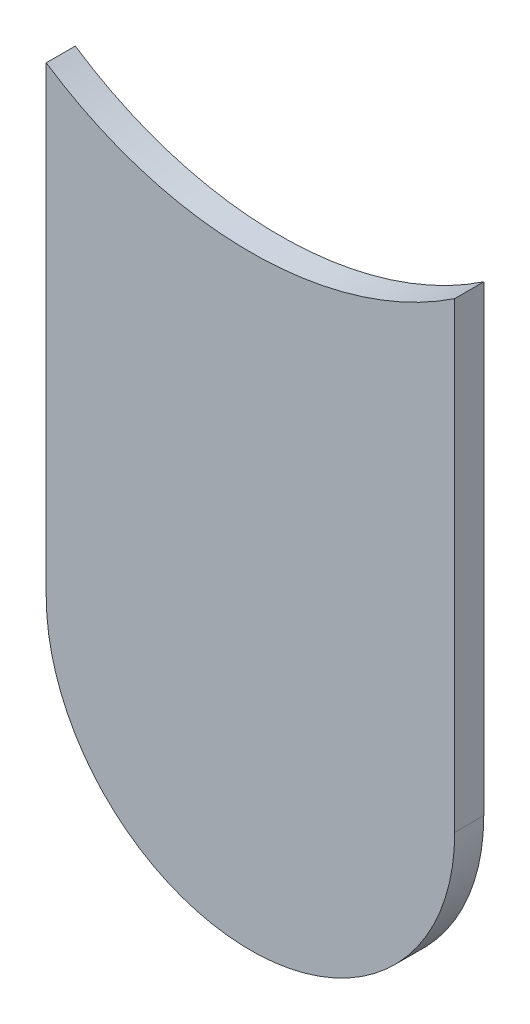
ISO-10303-21;
HEADER;
FILE_DESCRIPTION(('STEP AP214'),'2;1');
FILE_NAME('part.step','',(''),(''),'','','');
FILE_SCHEMA(('AUTOMOTIVE_DESIGN { 1 0 10303 214 1 1 1 1 }'));
ENDSEC;
DATA;
#1=APPLICATION_CONTEXT('core data for automotive mechanical design processes');
#2=APPLICATION_PROTOCOL_DEFINITION('international standard','automotive_design',2000,#1);
#3=PRODUCT_CONTEXT('',#1,'mechanical');
#4=PRODUCT('Part','Part','',(#3));
#5=PRODUCT_RELATED_PRODUCT_CATEGORY('part','',(#4));
#6=PRODUCT_DEFINITION_FORMATION('','',#4);
#7=PRODUCT_DEFINITION_CONTEXT('part definition',#1,'design');
#8=PRODUCT_DEFINITION('design','',#6,#7);
#9=PRODUCT_DEFINITION_SHAPE('','',#8);
#10=(LENGTH_UNIT() NAMED_UNIT(*) SI_UNIT(.MILLI.,.METRE.));
#11=(NAMED_UNIT(*) PLANE_ANGLE_UNIT() SI_UNIT($,.RADIAN.));
#12=(NAMED_UNIT(*) SI_UNIT($,.STERADIAN.) SOLID_ANGLE_UNIT());
#13=UNCERTAINTY_MEASURE_WITH_UNIT(LENGTH_MEASURE(1.E-05),#10,'distance_accuracy_value','');
#14=(GEOMETRIC_REPRESENTATION_CONTEXT(3) GLOBAL_UNCERTAINTY_ASSIGNED_CONTEXT((#13)) GLOBAL_UNIT_ASSIGNED_CONTEXT((#10,
#11,#12)) REPRESENTATION_CONTEXT('',''));
#15=CARTESIAN_POINT('',(0.,0.,0.));
#16=DIRECTION('',(0.,0.,1.));
#17=DIRECTION('',(1.,0.,0.));
#18=AXIS2_PLACEMENT_3D('',#15,#16,#17);
#19=CARTESIAN_POINT('',(117.1900247,115.5599924,0.));
#20=DIRECTION('',(-1.,0.,0.));
#21=DIRECTION('',(0.,1.,0.));
#22=AXIS2_PLACEMENT_3D('',#19,#20,#21);
#23=PLANE('',#22);
#24=DIRECTION('',(0.,1.,0.));
#25=VECTOR('',#24,1.);
#26=CARTESIAN_POINT('',(117.1900247,115.5599924,0.03556));
#27=LINE('',#26,#25);
#28=CARTESIAN_POINT('',(117.1900247,115.5599924,0.03556));
#29=VERTEX_POINT('',#28);
#30=CARTESIAN_POINT('',(117.1900247,116.125830609654,0.03556));
#31=VERTEX_POINT('',#30);
#32=EDGE_CURVE('E11',#29,#31,#27,.T.);
#33=ORIENTED_EDGE('',*,*,#32,.F.);
#34=DIRECTION('',(0.,0.,1.));
#35=VECTOR('',#34,1.);
#36=CARTESIAN_POINT('',(117.1900247,115.5599924,0.));
#37=LINE('',#36,#35);
#38=CARTESIAN_POINT('',(117.1900247,115.5599924,0.));
#39=VERTEX_POINT('',#38);
#40=EDGE_CURVE('E24',#39,#29,#37,.T.);
#41=ORIENTED_EDGE('',*,*,#40,.F.);
#42=DIRECTION('',(0.,1.,0.));
#43=VECTOR('',#42,1.);
#44=CARTESIAN_POINT('',(117.1900247,115.5599924,0.));
#45=LINE('',#44,#43);
#46=CARTESIAN_POINT('',(117.1900247,116.125830609654,0.));
#47=VERTEX_POINT('',#46);
#48=EDGE_CURVE('E75',#39,#47,#45,.T.);
#49=ORIENTED_EDGE('',*,*,#48,.T.);
#50=DIRECTION('',(0.,0.,1.));
#51=VECTOR('',#50,1.);
#52=CARTESIAN_POINT('',(117.1900247,116.125830609654,0.));
#53=LINE('',#52,#51);
#54=EDGE_CURVE('E37',#47,#31,#53,.T.);
#55=ORIENTED_EDGE('',*,*,#54,.T.);
#56=EDGE_LOOP('',(#33,#41,#49,#55));
#57=FACE_BOUND('',#56,.T.);
#58=ADVANCED_FACE('F17',(#57),#23,.F.);
#59=CARTESIAN_POINT('',(116.9400252,116.4999956,0.));
#60=DIRECTION('',(0.,0.,-1.));
#61=DIRECTION('',(1.,0.,0.));
#62=AXIS2_PLACEMENT_3D('',#59,#60,#61);
#63=CYLINDRICAL_SURFACE('',#62,0.4499991);
#64=DIRECTION('',(0.,0.,1.));
#65=VECTOR('',#64,1.);
#66=CARTESIAN_POINT('',(116.6900257,116.125830609654,0.));
#67=LINE('',#66,#65);
#68=CARTESIAN_POINT('',(116.6900257,116.125830609654,0.));
#69=VERTEX_POINT('',#68);
#70=CARTESIAN_POINT('',(116.6900257,116.125830609654,0.03556));
#71=VERTEX_POINT('',#70);
#72=EDGE_CURVE('E67',#69,#71,#67,.T.);
#73=ORIENTED_EDGE('',*,*,#72,.T.);
#74=CARTESIAN_POINT('',(116.9400252,116.4999956,0.03556));
#75=DIRECTION('',(0.,0.,1.));
#76=DIRECTION('',(1.,0.,0.));
#77=AXIS2_PLACEMENT_3D('',#74,#75,#76);
#78=CIRCLE('',#77,0.4499991);
#79=EDGE_CURVE('E82',#71,#31,#78,.T.);
#80=ORIENTED_EDGE('',*,*,#79,.T.);
#81=ORIENTED_EDGE('',*,*,#54,.F.);
#82=CARTESIAN_POINT('',(116.9400252,116.4999956,0.));
#83=DIRECTION('',(0.,0.,1.));
#84=DIRECTION('',(1.,0.,0.));
#85=AXIS2_PLACEMENT_3D('',#82,#83,#84);
#86=CIRCLE('',#85,0.4499991);
#87=EDGE_CURVE('E80',#69,#47,#86,.T.);
#88=ORIENTED_EDGE('',*,*,#87,.F.);
#89=EDGE_LOOP('',(#73,#80,#81,#88));
#90=FACE_BOUND('',#89,.T.);
#91=ADVANCED_FACE('F88',(#90),#63,.F.);
#92=CARTESIAN_POINT('',(116.6900257,116.125830609654,0.));
#93=DIRECTION('',(1.,0.,0.));
#94=DIRECTION('',(0.,-1.,0.));
#95=AXIS2_PLACEMENT_3D('',#92,#93,#94);
#96=PLANE('',#95);
#97=DIRECTION('',(0.,-1.,0.));
#98=VECTOR('',#97,1.);
#99=CARTESIAN_POINT('',(116.6900257,116.4999956,0.03556));
#100=LINE('',#99,#98);
#101=CARTESIAN_POINT('',(116.6900257,115.5599924,0.03556));
#102=VERTEX_POINT('',#101);
#103=EDGE_CURVE('E71',#71,#102,#100,.T.);
#104=ORIENTED_EDGE('',*,*,#103,.F.);
#105=ORIENTED_EDGE('',*,*,#72,.F.);
#106=DIRECTION('',(0.,-1.,0.));
#107=VECTOR('',#106,1.);
#108=CARTESIAN_POINT('',(116.6900257,116.4999956,0.));
#109=LINE('',#108,#107);
#110=CARTESIAN_POINT('',(116.6900257,115.5599924,0.));
#111=VERTEX_POINT('',#110);
#112=EDGE_CURVE('E63',#69,#111,#109,.T.);
#113=ORIENTED_EDGE('',*,*,#112,.T.);
#114=DIRECTION('',(0.,0.,1.));
#115=VECTOR('',#114,1.);
#116=CARTESIAN_POINT('',(116.6900257,115.5599924,0.));
#117=LINE('',#116,#115);
#118=EDGE_CURVE('E53',#111,#102,#117,.T.);
#119=ORIENTED_EDGE('',*,*,#118,.T.);
#120=EDGE_LOOP('',(#104,#105,#113,#119));
#121=FACE_BOUND('',#120,.T.);
#122=ADVANCED_FACE('F66',(#121),#96,.F.);
#123=CARTESIAN_POINT('',(116.9400252,115.5599924,0.));
#124=DIRECTION('',(0.,0.,-1.));
#125=DIRECTION('',(-1.,-1.13687065095752E-13,0.));
#126=AXIS2_PLACEMENT_3D('',#123,#124,#125);
#127=CYLINDRICAL_SURFACE('',#126,0.249999500000006);
#128=CARTESIAN_POINT('',(116.9400252,115.5599924,0.03556));
#129=DIRECTION('',(0.,0.,1.));
#130=DIRECTION('',(-1.,-1.13687065095752E-13,0.));
#131=AXIS2_PLACEMENT_3D('',#128,#129,#130);
#132=CIRCLE('',#131,0.249999500000006);
#133=EDGE_CURVE('E59',#102,#29,#132,.T.);
#134=ORIENTED_EDGE('',*,*,#133,.F.);
#135=ORIENTED_EDGE('',*,*,#118,.F.);
#136=CARTESIAN_POINT('',(116.9400252,115.5599924,0.));
#137=DIRECTION('',(0.,0.,1.));
#138=DIRECTION('',(-1.,-1.13687065095752E-13,0.));
#139=AXIS2_PLACEMENT_3D('',#136,#137,#138);
#140=CIRCLE('',#139,0.249999500000006);
#141=EDGE_CURVE('E57',#111,#39,#140,.T.);
#142=ORIENTED_EDGE('',*,*,#141,.T.);
#143=ORIENTED_EDGE('',*,*,#40,.T.);
#144=EDGE_LOOP('',(#134,#135,#142,#143));
#145=FACE_BOUND('',#144,.T.);
#146=ADVANCED_FACE('F55',(#145),#127,.T.);
#147=CARTESIAN_POINT('',(117.1900247,115.5599924,0.));
#148=DIRECTION('',(0.,0.,-1.));
#149=DIRECTION('',(-1.,0.,0.));
#150=AXIS2_PLACEMENT_3D('',#147,#148,#149);
#151=PLANE('',#150);
#152=ORIENTED_EDGE('',*,*,#48,.F.);
#153=ORIENTED_EDGE('',*,*,#141,.F.);
#154=ORIENTED_EDGE('',*,*,#112,.F.);
#155=ORIENTED_EDGE('',*,*,#87,.T.);
#156=EDGE_LOOP('',(#152,#153,#154,#155));
#157=FACE_BOUND('',#156,.T.);
#158=ADVANCED_FACE('F74',(#157),#151,.T.);
#159=CARTESIAN_POINT('',(117.1900247,115.5599924,0.03556));
#160=DIRECTION('',(0.,0.,-1.));
#161=DIRECTION('',(-1.,0.,0.));
#162=AXIS2_PLACEMENT_3D('',#159,#160,#161);
#163=PLANE('',#162);
#164=ORIENTED_EDGE('',*,*,#133,.T.);
#165=ORIENTED_EDGE('',*,*,#32,.T.);
#166=ORIENTED_EDGE('',*,*,#79,.F.);
#167=ORIENTED_EDGE('',*,*,#103,.T.);
#168=EDGE_LOOP('',(#164,#165,#166,#167));
#169=FACE_BOUND('',#168,.T.);
#170=ADVANCED_FACE('F91',(#169),#163,.F.);
#171=CLOSED_SHELL('',(#58,#91,#122,#146,#158,#170));
#172=MANIFOLD_SOLID_BREP('B1',#171);
#173=ADVANCED_BREP_SHAPE_REPRESENTATION('',(#18,#172),#14);
#174=SHAPE_DEFINITION_REPRESENTATION(#9,#173);
ENDSEC;
END-ISO-10303-21;
